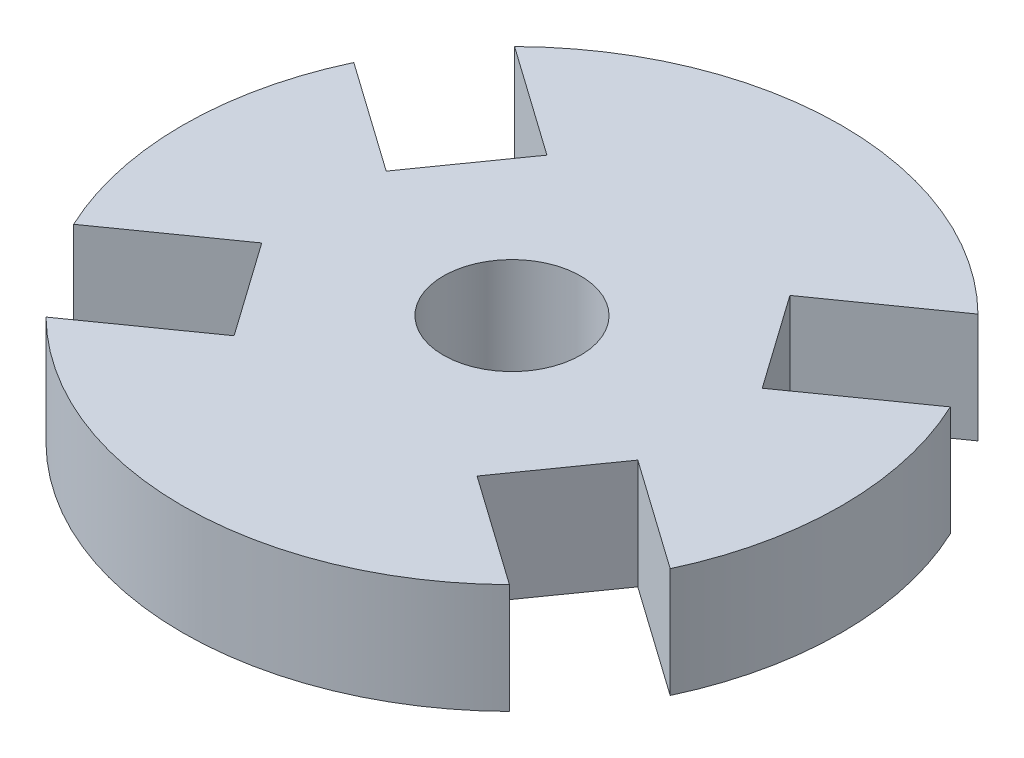
ISO-10303-21;
HEADER;
FILE_DESCRIPTION(('STEP AP214'),'2;1');
FILE_NAME('part.step','',(''),(''),'','','');
FILE_SCHEMA(('AUTOMOTIVE_DESIGN { 1 0 10303 214 1 1 1 1 }'));
ENDSEC;
DATA;
#1=APPLICATION_CONTEXT('core data for automotive mechanical design processes');
#2=APPLICATION_PROTOCOL_DEFINITION('international standard','automotive_design',2000,#1);
#3=PRODUCT_CONTEXT('',#1,'mechanical');
#4=PRODUCT('Part','Part','',(#3));
#5=PRODUCT_RELATED_PRODUCT_CATEGORY('part','',(#4));
#6=PRODUCT_DEFINITION_FORMATION('','',#4);
#7=PRODUCT_DEFINITION_CONTEXT('part definition',#1,'design');
#8=PRODUCT_DEFINITION('design','',#6,#7);
#9=PRODUCT_DEFINITION_SHAPE('','',#8);
#10=(LENGTH_UNIT() NAMED_UNIT(*) SI_UNIT(.MILLI.,.METRE.));
#11=(NAMED_UNIT(*) PLANE_ANGLE_UNIT() SI_UNIT($,.RADIAN.));
#12=(NAMED_UNIT(*) SI_UNIT($,.STERADIAN.) SOLID_ANGLE_UNIT());
#13=UNCERTAINTY_MEASURE_WITH_UNIT(LENGTH_MEASURE(1.E-05),#10,'distance_accuracy_value','');
#14=(GEOMETRIC_REPRESENTATION_CONTEXT(3) GLOBAL_UNCERTAINTY_ASSIGNED_CONTEXT((#13)) GLOBAL_UNIT_ASSIGNED_CONTEXT((#10,
#11,#12)) REPRESENTATION_CONTEXT('',''));
#15=CARTESIAN_POINT('',(0.,0.,0.));
#16=DIRECTION('',(0.,0.,1.));
#17=DIRECTION('',(1.,0.,0.));
#18=AXIS2_PLACEMENT_3D('',#15,#16,#17);
#19=CARTESIAN_POINT('',(0.,4.,0.));
#20=DIRECTION('',(0.,-1.,0.));
#21=DIRECTION('',(0.,0.,-1.));
#22=AXIS2_PLACEMENT_3D('',#19,#20,#21);
#23=CYLINDRICAL_SURFACE('',#22,12.);
#24=CARTESIAN_POINT('',(0.,0.,0.));
#25=DIRECTION('',(0.,1.,0.));
#26=DIRECTION('',(0.,0.,1.));
#27=AXIS2_PLACEMENT_3D('',#24,#25,#26);
#28=CIRCLE('',#27,12.);
#29=CARTESIAN_POINT('',(8.43841933973867,0.,-8.53188601932331));
#30=VERTEX_POINT('',#29);
#31=CARTESIAN_POINT('',(-8.43841933973867,0.,-8.53188601932331));
#32=VERTEX_POINT('',#31);
#33=EDGE_CURVE('E254',#30,#32,#28,.T.);
#34=ORIENTED_EDGE('',*,*,#33,.T.);
#35=DIRECTION('',(0.,-1.,0.));
#36=VECTOR('',#35,1.);
#37=CARTESIAN_POINT('',(-8.43841933973867,4.,-8.53188601932331));
#38=LINE('',#37,#36);
#39=CARTESIAN_POINT('',(-8.43841933973867,4.,-8.53188601932331));
#40=VERTEX_POINT('',#39);
#41=EDGE_CURVE('E159',#32,#40,#38,.F.);
#42=ORIENTED_EDGE('',*,*,#41,.T.);
#43=CARTESIAN_POINT('',(0.,4.,0.));
#44=DIRECTION('',(0.,1.,0.));
#45=DIRECTION('',(0.,0.,1.));
#46=AXIS2_PLACEMENT_3D('',#43,#44,#45);
#47=CIRCLE('',#46,12.);
#48=CARTESIAN_POINT('',(8.43841933973867,4.,-8.53188601932331));
#49=VERTEX_POINT('',#48);
#50=EDGE_CURVE('E248',#49,#40,#47,.T.);
#51=ORIENTED_EDGE('',*,*,#50,.F.);
#52=DIRECTION('',(0.,-1.,0.));
#53=VECTOR('',#52,1.);
#54=CARTESIAN_POINT('',(8.43841933973867,4.,-8.53188601932331));
#55=LINE('',#54,#53);
#56=EDGE_CURVE('E261',#49,#30,#55,.T.);
#57=ORIENTED_EDGE('',*,*,#56,.T.);
#58=EDGE_LOOP('',(#34,#42,#51,#57));
#59=FACE_BOUND('',#58,.T.);
#60=ADVANCED_FACE('F33',(#59),#23,.T.);
#61=CARTESIAN_POINT('',(-8.43841933973867,0.,8.53188601932331));
#62=VERTEX_POINT('',#61);
#63=CARTESIAN_POINT('',(8.43841933973867,0.,8.53188601932331));
#64=VERTEX_POINT('',#63);
#65=EDGE_CURVE('E258',#62,#64,#28,.T.);
#66=ORIENTED_EDGE('',*,*,#65,.T.);
#67=DIRECTION('',(0.,-1.,0.));
#68=VECTOR('',#67,1.);
#69=CARTESIAN_POINT('',(8.43841933973867,4.,8.53188601932331));
#70=LINE('',#69,#68);
#71=CARTESIAN_POINT('',(8.43841933973867,4.,8.53188601932331));
#72=VERTEX_POINT('',#71);
#73=EDGE_CURVE('E41',#64,#72,#70,.F.);
#74=ORIENTED_EDGE('',*,*,#73,.T.);
#75=CARTESIAN_POINT('',(-8.43841933973867,4.,8.53188601932331));
#76=VERTEX_POINT('',#75);
#77=EDGE_CURVE('E253',#76,#72,#47,.T.);
#78=ORIENTED_EDGE('',*,*,#77,.F.);
#79=DIRECTION('',(0.,-1.,0.));
#80=VECTOR('',#79,1.);
#81=CARTESIAN_POINT('',(-8.43841933973867,4.,8.53188601932331));
#82=LINE('',#81,#80);
#83=EDGE_CURVE('E264',#76,#62,#82,.T.);
#84=ORIENTED_EDGE('',*,*,#83,.T.);
#85=EDGE_LOOP('',(#66,#74,#78,#84));
#86=FACE_BOUND('',#85,.T.);
#87=ADVANCED_FACE('F276',(#86),#23,.T.);
#88=CARTESIAN_POINT('',(-10.8616451333047,4.,-5.10143754231678));
#89=VERTEX_POINT('',#88);
#90=CARTESIAN_POINT('',(-10.8616451333047,4.,5.10143754231678));
#91=VERTEX_POINT('',#90);
#92=EDGE_CURVE('E252',#89,#91,#47,.T.);
#93=ORIENTED_EDGE('',*,*,#92,.F.);
#94=DIRECTION('',(0.,-1.,0.));
#95=VECTOR('',#94,1.);
#96=CARTESIAN_POINT('',(-10.8616451333047,4.,-5.10143754231678));
#97=LINE('',#96,#95);
#98=CARTESIAN_POINT('',(-10.8616451333047,0.,-5.10143754231678));
#99=VERTEX_POINT('',#98);
#100=EDGE_CURVE('E152',#89,#99,#97,.T.);
#101=ORIENTED_EDGE('',*,*,#100,.T.);
#102=CARTESIAN_POINT('',(-10.8616451333047,0.,5.10143754231678));
#103=VERTEX_POINT('',#102);
#104=EDGE_CURVE('E257',#99,#103,#28,.T.);
#105=ORIENTED_EDGE('',*,*,#104,.T.);
#106=DIRECTION('',(0.,-1.,0.));
#107=VECTOR('',#106,1.);
#108=CARTESIAN_POINT('',(-10.8616451333047,4.,5.10143754231678));
#109=LINE('',#108,#107);
#110=EDGE_CURVE('E267',#103,#91,#109,.F.);
#111=ORIENTED_EDGE('',*,*,#110,.T.);
#112=EDGE_LOOP('',(#93,#101,#105,#111));
#113=FACE_BOUND('',#112,.T.);
#114=ADVANCED_FACE('F300',(#113),#23,.T.);
#115=CARTESIAN_POINT('',(0.,4.,0.));
#116=DIRECTION('',(0.,1.,0.));
#117=DIRECTION('',(0.,0.,1.));
#118=AXIS2_PLACEMENT_3D('',#115,#116,#117);
#119=PLANE('',#118);
#120=DIRECTION('',(-0.816773446906316,0.,-0.57695852227762));
#121=VECTOR('',#120,1.);
#122=CARTESIAN_POINT('',(-12.755213045315,4.,-11.5812149694506));
#123=LINE('',#122,#121);
#124=CARTESIAN_POINT('',(-4.42412388687059,4.,-5.69623804221884));
#125=VERTEX_POINT('',#124);
#126=EDGE_CURVE('E167',#125,#40,#123,.T.);
#127=ORIENTED_EDGE('',*,*,#126,.F.);
#128=DIRECTION('',(0.57695852227762,0.,-0.816773446906316));
#129=VECTOR('',#128,1.);
#130=CARTESIAN_POINT('',(-6.84734968043659,4.,-2.26578956521231));
#131=LINE('',#130,#129);
#132=CARTESIAN_POINT('',(-6.84734968043659,4.,-2.26578956521231));
#133=VERTEX_POINT('',#132);
#134=EDGE_CURVE('E149',#133,#125,#131,.T.);
#135=ORIENTED_EDGE('',*,*,#134,.F.);
#136=DIRECTION('',(0.816773446906317,0.,0.57695852227762));
#137=VECTOR('',#136,1.);
#138=CARTESIAN_POINT('',(-15.178438838881,4.,-8.15076649244404));
#139=LINE('',#138,#137);
#140=EDGE_CURVE('E171',#89,#133,#139,.T.);
#141=ORIENTED_EDGE('',*,*,#140,.F.);
#142=ORIENTED_EDGE('',*,*,#92,.T.);
#143=DIRECTION('',(-0.816773446906316,0.,0.57695852227762));
#144=VECTOR('',#143,1.);
#145=CARTESIAN_POINT('',(-15.178438838881,4.,8.15076649244404));
#146=LINE('',#145,#144);
#147=CARTESIAN_POINT('',(-6.84734968043659,4.,2.26578956521231));
#148=VERTEX_POINT('',#147);
#149=EDGE_CURVE('E202',#148,#91,#146,.T.);
#150=ORIENTED_EDGE('',*,*,#149,.F.);
#151=DIRECTION('',(-0.57695852227762,0.,-0.816773446906316));
#152=VECTOR('',#151,1.);
#153=CARTESIAN_POINT('',(-4.42412388687059,4.,5.69623804221884));
#154=LINE('',#153,#152);
#155=CARTESIAN_POINT('',(-4.42412388687059,4.,5.69623804221884));
#156=VERTEX_POINT('',#155);
#157=EDGE_CURVE('E210',#156,#148,#154,.T.);
#158=ORIENTED_EDGE('',*,*,#157,.F.);
#159=DIRECTION('',(0.816773446906316,0.,-0.57695852227762));
#160=VECTOR('',#159,1.);
#161=CARTESIAN_POINT('',(-12.755213045315,4.,11.5812149694506));
#162=LINE('',#161,#160);
#163=EDGE_CURVE('E195',#76,#156,#162,.T.);
#164=ORIENTED_EDGE('',*,*,#163,.F.);
#165=ORIENTED_EDGE('',*,*,#77,.T.);
#166=DIRECTION('',(0.816773446906316,0.,0.57695852227762));
#167=VECTOR('',#166,1.);
#168=CARTESIAN_POINT('',(12.755213045315,4.,11.5812149694506));
#169=LINE('',#168,#167);
#170=CARTESIAN_POINT('',(4.42412388687059,4.,5.69623804221884));
#171=VERTEX_POINT('',#170);
#172=EDGE_CURVE('E181',#171,#72,#169,.T.);
#173=ORIENTED_EDGE('',*,*,#172,.F.);
#174=DIRECTION('',(-0.57695852227762,0.,0.816773446906316));
#175=VECTOR('',#174,1.);
#176=CARTESIAN_POINT('',(4.42412388687059,4.,5.69623804221884));
#177=LINE('',#176,#175);
#178=CARTESIAN_POINT('',(6.84734968043659,4.,2.26578956521231));
#179=VERTEX_POINT('',#178);
#180=EDGE_CURVE('E189',#179,#171,#177,.T.);
#181=ORIENTED_EDGE('',*,*,#180,.F.);
#182=DIRECTION('',(-0.816773446906316,0.,-0.57695852227762));
#183=VECTOR('',#182,1.);
#184=CARTESIAN_POINT('',(15.178438838881,4.,8.15076649244404));
#185=LINE('',#184,#183);
#186=CARTESIAN_POINT('',(10.8616451333047,4.,5.10143754231678));
#187=VERTEX_POINT('',#186);
#188=EDGE_CURVE('E178',#187,#179,#185,.T.);
#189=ORIENTED_EDGE('',*,*,#188,.F.);
#190=CARTESIAN_POINT('',(10.8616451333047,4.,-5.10143754231678));
#191=VERTEX_POINT('',#190);
#192=EDGE_CURVE('E256',#187,#191,#47,.T.);
#193=ORIENTED_EDGE('',*,*,#192,.T.);
#194=DIRECTION('',(0.816773446906317,0.,-0.57695852227762));
#195=VECTOR('',#194,1.);
#196=CARTESIAN_POINT('',(15.178438838881,4.,-8.15076649244404));
#197=LINE('',#196,#195);
#198=CARTESIAN_POINT('',(6.84734968043659,4.,-2.26578956521231));
#199=VERTEX_POINT('',#198);
#200=EDGE_CURVE('E233',#199,#191,#197,.T.);
#201=ORIENTED_EDGE('',*,*,#200,.F.);
#202=DIRECTION('',(0.57695852227762,0.,0.816773446906316));
#203=VECTOR('',#202,1.);
#204=CARTESIAN_POINT('',(6.84734968043659,4.,-2.26578956521231));
#205=LINE('',#204,#203);
#206=CARTESIAN_POINT('',(4.42412388687059,4.,-5.69623804221884));
#207=VERTEX_POINT('',#206);
#208=EDGE_CURVE('E217',#207,#199,#205,.T.);
#209=ORIENTED_EDGE('',*,*,#208,.F.);
#210=DIRECTION('',(-0.816773446906316,0.,0.57695852227762));
#211=VECTOR('',#210,1.);
#212=CARTESIAN_POINT('',(12.755213045315,4.,-11.5812149694506));
#213=LINE('',#212,#211);
#214=EDGE_CURVE('E224',#49,#207,#213,.T.);
#215=ORIENTED_EDGE('',*,*,#214,.F.);
#216=ORIENTED_EDGE('',*,*,#50,.T.);
#217=EDGE_LOOP('',(#127,#135,#141,#142,#150,#158,#164,#165,#173,#181,#189,#193,#201,#209,#215,#216));
#218=FACE_BOUND('',#217,.T.);
#219=CARTESIAN_POINT('',(0.,4.,0.));
#220=DIRECTION('',(0.,1.,0.));
#221=DIRECTION('',(0.,0.,1.));
#222=AXIS2_PLACEMENT_3D('',#219,#220,#221);
#223=CIRCLE('',#222,2.5);
#224=CARTESIAN_POINT('',(0.,4.,2.5));
#225=VERTEX_POINT('',#224);
#226=EDGE_CURVE('E242',#225,#225,#223,.T.);
#227=ORIENTED_EDGE('',*,*,#226,.F.);
#228=EDGE_LOOP('',(#227));
#229=FACE_BOUND('',#228,.T.);
#230=ADVANCED_FACE('F283',(#218,#229),#119,.T.);
#231=CARTESIAN_POINT('',(0.,0.,0.));
#232=DIRECTION('',(0.,1.,0.));
#233=DIRECTION('',(0.,0.,1.));
#234=AXIS2_PLACEMENT_3D('',#231,#232,#233);
#235=PLANE('',#234);
#236=DIRECTION('',(0.57695852227762,0.,-0.816773446906316));
#237=VECTOR('',#236,1.);
#238=CARTESIAN_POINT('',(-6.84734968043659,0.,-2.26578956521231));
#239=LINE('',#238,#237);
#240=CARTESIAN_POINT('',(-6.84734968043659,0.,-2.26578956521232));
#241=VERTEX_POINT('',#240);
#242=CARTESIAN_POINT('',(-4.42412388687059,0.,-5.69623804221884));
#243=VERTEX_POINT('',#242);
#244=EDGE_CURVE('E48',#241,#243,#239,.T.);
#245=ORIENTED_EDGE('',*,*,#244,.T.);
#246=DIRECTION('',(-0.816773446906316,0.,-0.57695852227762));
#247=VECTOR('',#246,1.);
#248=CARTESIAN_POINT('',(-12.755213045315,0.,-11.5812149694506));
#249=LINE('',#248,#247);
#250=EDGE_CURVE('E156',#243,#32,#249,.T.);
#251=ORIENTED_EDGE('',*,*,#250,.T.);
#252=ORIENTED_EDGE('',*,*,#33,.F.);
#253=DIRECTION('',(-0.816773446906316,0.,0.57695852227762));
#254=VECTOR('',#253,1.);
#255=CARTESIAN_POINT('',(12.755213045315,0.,-11.5812149694506));
#256=LINE('',#255,#254);
#257=CARTESIAN_POINT('',(4.42412388687059,0.,-5.69623804221884));
#258=VERTEX_POINT('',#257);
#259=EDGE_CURVE('E227',#30,#258,#256,.T.);
#260=ORIENTED_EDGE('',*,*,#259,.T.);
#261=DIRECTION('',(0.57695852227762,0.,0.816773446906316));
#262=VECTOR('',#261,1.);
#263=CARTESIAN_POINT('',(6.84734968043659,0.,-2.26578956521231));
#264=LINE('',#263,#262);
#265=CARTESIAN_POINT('',(6.84734968043659,0.,-2.26578956521231));
#266=VERTEX_POINT('',#265);
#267=EDGE_CURVE('E220',#258,#266,#264,.T.);
#268=ORIENTED_EDGE('',*,*,#267,.T.);
#269=DIRECTION('',(0.816773446906317,0.,-0.57695852227762));
#270=VECTOR('',#269,1.);
#271=CARTESIAN_POINT('',(15.178438838881,0.,-8.15076649244404));
#272=LINE('',#271,#270);
#273=CARTESIAN_POINT('',(10.8616451333047,0.,-5.10143754231678));
#274=VERTEX_POINT('',#273);
#275=EDGE_CURVE('E223',#266,#274,#272,.T.);
#276=ORIENTED_EDGE('',*,*,#275,.T.);
#277=CARTESIAN_POINT('',(10.8616451333047,0.,5.10143754231678));
#278=VERTEX_POINT('',#277);
#279=EDGE_CURVE('E245',#278,#274,#28,.T.);
#280=ORIENTED_EDGE('',*,*,#279,.F.);
#281=DIRECTION('',(-0.816773446906316,0.,-0.57695852227762));
#282=VECTOR('',#281,1.);
#283=CARTESIAN_POINT('',(15.178438838881,0.,8.15076649244404));
#284=LINE('',#283,#282);
#285=CARTESIAN_POINT('',(6.84734968043659,0.,2.26578956521231));
#286=VERTEX_POINT('',#285);
#287=EDGE_CURVE('E56',#278,#286,#284,.T.);
#288=ORIENTED_EDGE('',*,*,#287,.T.);
#289=DIRECTION('',(-0.57695852227762,0.,0.816773446906316));
#290=VECTOR('',#289,1.);
#291=CARTESIAN_POINT('',(4.42412388687059,0.,5.69623804221884));
#292=LINE('',#291,#290);
#293=CARTESIAN_POINT('',(4.42412388687059,0.,5.69623804221884));
#294=VERTEX_POINT('',#293);
#295=EDGE_CURVE('E180',#286,#294,#292,.T.);
#296=ORIENTED_EDGE('',*,*,#295,.T.);
#297=DIRECTION('',(0.816773446906316,0.,0.57695852227762));
#298=VECTOR('',#297,1.);
#299=CARTESIAN_POINT('',(12.755213045315,0.,11.5812149694506));
#300=LINE('',#299,#298);
#301=EDGE_CURVE('E184',#294,#64,#300,.T.);
#302=ORIENTED_EDGE('',*,*,#301,.T.);
#303=ORIENTED_EDGE('',*,*,#65,.F.);
#304=DIRECTION('',(0.816773446906316,0.,-0.57695852227762));
#305=VECTOR('',#304,1.);
#306=CARTESIAN_POINT('',(-12.755213045315,0.,11.5812149694506));
#307=LINE('',#306,#305);
#308=CARTESIAN_POINT('',(-4.42412388687059,0.,5.69623804221884));
#309=VERTEX_POINT('',#308);
#310=EDGE_CURVE('E198',#62,#309,#307,.T.);
#311=ORIENTED_EDGE('',*,*,#310,.T.);
#312=DIRECTION('',(-0.57695852227762,0.,-0.816773446906316));
#313=VECTOR('',#312,1.);
#314=CARTESIAN_POINT('',(-4.42412388687059,0.,5.69623804221884));
#315=LINE('',#314,#313);
#316=CARTESIAN_POINT('',(-6.84734968043659,0.,2.26578956521231));
#317=VERTEX_POINT('',#316);
#318=EDGE_CURVE('E201',#309,#317,#315,.T.);
#319=ORIENTED_EDGE('',*,*,#318,.T.);
#320=DIRECTION('',(-0.816773446906316,0.,0.57695852227762));
#321=VECTOR('',#320,1.);
#322=CARTESIAN_POINT('',(-15.178438838881,0.,8.15076649244404));
#323=LINE('',#322,#321);
#324=EDGE_CURVE('E205',#317,#103,#323,.T.);
#325=ORIENTED_EDGE('',*,*,#324,.T.);
#326=ORIENTED_EDGE('',*,*,#104,.F.);
#327=DIRECTION('',(0.816773446906317,0.,0.57695852227762));
#328=VECTOR('',#327,1.);
#329=CARTESIAN_POINT('',(-1.211612896783,0.,1.71522423850326));
#330=LINE('',#329,#328);
#331=EDGE_CURVE('E11',#99,#241,#330,.T.);
#332=ORIENTED_EDGE('',*,*,#331,.T.);
#333=EDGE_LOOP('',(#245,#251,#252,#260,#268,#276,#280,#288,#296,#302,#303,#311,#319,#325,#326,#332));
#334=FACE_BOUND('',#333,.T.);
#335=CARTESIAN_POINT('',(0.,0.,0.));
#336=DIRECTION('',(0.,1.,0.));
#337=DIRECTION('',(0.,0.,1.));
#338=AXIS2_PLACEMENT_3D('',#335,#336,#337);
#339=CIRCLE('',#338,2.5);
#340=CARTESIAN_POINT('',(0.,0.,2.5));
#341=VERTEX_POINT('',#340);
#342=EDGE_CURVE('E240',#341,#341,#339,.T.);
#343=ORIENTED_EDGE('',*,*,#342,.T.);
#344=EDGE_LOOP('',(#343));
#345=FACE_BOUND('',#344,.T.);
#346=ADVANCED_FACE('F164',(#334,#345),#235,.F.);
#347=ORIENTED_EDGE('',*,*,#192,.F.);
#348=DIRECTION('',(0.,-1.,0.));
#349=VECTOR('',#348,1.);
#350=CARTESIAN_POINT('',(10.8616451333047,4.,5.10143754231678));
#351=LINE('',#350,#349);
#352=EDGE_CURVE('E270',#187,#278,#351,.T.);
#353=ORIENTED_EDGE('',*,*,#352,.T.);
#354=ORIENTED_EDGE('',*,*,#279,.T.);
#355=DIRECTION('',(0.,-1.,0.));
#356=VECTOR('',#355,1.);
#357=CARTESIAN_POINT('',(10.8616451333047,4.,-5.10143754231678));
#358=LINE('',#357,#356);
#359=EDGE_CURVE('E251',#274,#191,#358,.F.);
#360=ORIENTED_EDGE('',*,*,#359,.T.);
#361=EDGE_LOOP('',(#347,#353,#354,#360));
#362=FACE_BOUND('',#361,.T.);
#363=ADVANCED_FACE('F35',(#362),#23,.T.);
#364=CARTESIAN_POINT('',(0.,4.,0.));
#365=DIRECTION('',(0.,-1.,0.));
#366=DIRECTION('',(0.,0.,-1.));
#367=AXIS2_PLACEMENT_3D('',#364,#365,#366);
#368=CYLINDRICAL_SURFACE('',#367,2.5);
#369=ORIENTED_EDGE('',*,*,#226,.T.);
#370=EDGE_LOOP('',(#369));
#371=FACE_BOUND('',#370,.T.);
#372=ORIENTED_EDGE('',*,*,#342,.F.);
#373=EDGE_LOOP('',(#372));
#374=FACE_BOUND('',#373,.T.);
#375=ADVANCED_FACE('F327',(#371,#374),#368,.F.);
#376=CARTESIAN_POINT('',(12.755213045315,0.,-11.5812149694506));
#377=DIRECTION('',(-0.57695852227762,0.,-0.816773446906316));
#378=DIRECTION('',(-0.816773446906316,0.,0.57695852227762));
#379=AXIS2_PLACEMENT_3D('',#376,#377,#378);
#380=PLANE('',#379);
#381=ORIENTED_EDGE('',*,*,#214,.T.);
#382=DIRECTION('',(0.,1.,0.));
#383=VECTOR('',#382,1.);
#384=CARTESIAN_POINT('',(4.42412388687059,0.,-5.69623804221884));
#385=LINE('',#384,#383);
#386=EDGE_CURVE('E237',#258,#207,#385,.T.);
#387=ORIENTED_EDGE('',*,*,#386,.F.);
#388=ORIENTED_EDGE('',*,*,#259,.F.);
#389=ORIENTED_EDGE('',*,*,#56,.F.);
#390=EDGE_LOOP('',(#381,#387,#388,#389));
#391=FACE_BOUND('',#390,.T.);
#392=ADVANCED_FACE('F332',(#391),#380,.F.);
#393=CARTESIAN_POINT('',(15.178438838881,0.,-8.15076649244404));
#394=DIRECTION('',(0.57695852227762,0.,0.816773446906317));
#395=DIRECTION('',(0.816773446906317,0.,-0.57695852227762));
#396=AXIS2_PLACEMENT_3D('',#393,#394,#395);
#397=PLANE('',#396);
#398=ORIENTED_EDGE('',*,*,#275,.F.);
#399=DIRECTION('',(0.,1.,0.));
#400=VECTOR('',#399,1.);
#401=CARTESIAN_POINT('',(6.84734968043659,0.,-2.26578956521231));
#402=LINE('',#401,#400);
#403=EDGE_CURVE('E230',#266,#199,#402,.T.);
#404=ORIENTED_EDGE('',*,*,#403,.T.);
#405=ORIENTED_EDGE('',*,*,#200,.T.);
#406=ORIENTED_EDGE('',*,*,#359,.F.);
#407=EDGE_LOOP('',(#398,#404,#405,#406));
#408=FACE_BOUND('',#407,.T.);
#409=ADVANCED_FACE('F295',(#408),#397,.F.);
#410=CARTESIAN_POINT('',(6.84734968043659,0.,-2.26578956521231));
#411=DIRECTION('',(-0.816773446906316,0.,0.57695852227762));
#412=DIRECTION('',(0.57695852227762,0.,0.816773446906316));
#413=AXIS2_PLACEMENT_3D('',#410,#411,#412);
#414=PLANE('',#413);
#415=ORIENTED_EDGE('',*,*,#208,.T.);
#416=ORIENTED_EDGE('',*,*,#403,.F.);
#417=ORIENTED_EDGE('',*,*,#267,.F.);
#418=ORIENTED_EDGE('',*,*,#386,.T.);
#419=EDGE_LOOP('',(#415,#416,#417,#418));
#420=FACE_BOUND('',#419,.T.);
#421=ADVANCED_FACE('F343',(#420),#414,.F.);
#422=CARTESIAN_POINT('',(-15.178438838881,0.,8.15076649244404));
#423=DIRECTION('',(-0.57695852227762,0.,-0.816773446906316));
#424=DIRECTION('',(-0.816773446906316,0.,0.57695852227762));
#425=AXIS2_PLACEMENT_3D('',#422,#423,#424);
#426=PLANE('',#425);
#427=ORIENTED_EDGE('',*,*,#324,.F.);
#428=DIRECTION('',(0.,1.,0.));
#429=VECTOR('',#428,1.);
#430=CARTESIAN_POINT('',(-6.84734968043659,0.,2.26578956521231));
#431=LINE('',#430,#429);
#432=EDGE_CURVE('E215',#317,#148,#431,.T.);
#433=ORIENTED_EDGE('',*,*,#432,.T.);
#434=ORIENTED_EDGE('',*,*,#149,.T.);
#435=ORIENTED_EDGE('',*,*,#110,.F.);
#436=EDGE_LOOP('',(#427,#433,#434,#435));
#437=FACE_BOUND('',#436,.T.);
#438=ADVANCED_FACE('F303',(#437),#426,.F.);
#439=CARTESIAN_POINT('',(-12.755213045315,0.,11.5812149694506));
#440=DIRECTION('',(0.57695852227762,0.,0.816773446906316));
#441=DIRECTION('',(0.816773446906316,0.,-0.57695852227762));
#442=AXIS2_PLACEMENT_3D('',#439,#440,#441);
#443=PLANE('',#442);
#444=ORIENTED_EDGE('',*,*,#163,.T.);
#445=DIRECTION('',(0.,1.,0.));
#446=VECTOR('',#445,1.);
#447=CARTESIAN_POINT('',(-4.42412388687059,0.,5.69623804221884));
#448=LINE('',#447,#446);
#449=EDGE_CURVE('E208',#309,#156,#448,.T.);
#450=ORIENTED_EDGE('',*,*,#449,.F.);
#451=ORIENTED_EDGE('',*,*,#310,.F.);
#452=ORIENTED_EDGE('',*,*,#83,.F.);
#453=EDGE_LOOP('',(#444,#450,#451,#452));
#454=FACE_BOUND('',#453,.T.);
#455=ADVANCED_FACE('F352',(#454),#443,.F.);
#456=CARTESIAN_POINT('',(-4.42412388687059,0.,5.69623804221884));
#457=DIRECTION('',(0.816773446906316,0.,-0.57695852227762));
#458=DIRECTION('',(-0.57695852227762,0.,-0.816773446906316));
#459=AXIS2_PLACEMENT_3D('',#456,#457,#458);
#460=PLANE('',#459);
#461=ORIENTED_EDGE('',*,*,#157,.T.);
#462=ORIENTED_EDGE('',*,*,#432,.F.);
#463=ORIENTED_EDGE('',*,*,#318,.F.);
#464=ORIENTED_EDGE('',*,*,#449,.T.);
#465=EDGE_LOOP('',(#461,#462,#463,#464));
#466=FACE_BOUND('',#465,.T.);
#467=ADVANCED_FACE('F307',(#466),#460,.F.);
#468=CARTESIAN_POINT('',(12.755213045315,0.,11.5812149694506));
#469=DIRECTION('',(-0.57695852227762,0.,0.816773446906316));
#470=DIRECTION('',(0.816773446906316,0.,0.57695852227762));
#471=AXIS2_PLACEMENT_3D('',#468,#469,#470);
#472=PLANE('',#471);
#473=ORIENTED_EDGE('',*,*,#301,.F.);
#474=DIRECTION('',(0.,1.,0.));
#475=VECTOR('',#474,1.);
#476=CARTESIAN_POINT('',(4.42412388687059,0.,5.69623804221884));
#477=LINE('',#476,#475);
#478=EDGE_CURVE('E193',#294,#171,#477,.T.);
#479=ORIENTED_EDGE('',*,*,#478,.T.);
#480=ORIENTED_EDGE('',*,*,#172,.T.);
#481=ORIENTED_EDGE('',*,*,#73,.F.);
#482=EDGE_LOOP('',(#473,#479,#480,#481));
#483=FACE_BOUND('',#482,.T.);
#484=ADVANCED_FACE('F358',(#483),#472,.F.);
#485=CARTESIAN_POINT('',(15.178438838881,0.,8.15076649244404));
#486=DIRECTION('',(0.57695852227762,0.,-0.816773446906316));
#487=DIRECTION('',(-0.816773446906316,0.,-0.57695852227762));
#488=AXIS2_PLACEMENT_3D('',#485,#486,#487);
#489=PLANE('',#488);
#490=ORIENTED_EDGE('',*,*,#188,.T.);
#491=DIRECTION('',(0.,1.,0.));
#492=VECTOR('',#491,1.);
#493=CARTESIAN_POINT('',(6.84734968043659,0.,2.26578956521231));
#494=LINE('',#493,#492);
#495=EDGE_CURVE('E187',#286,#179,#494,.T.);
#496=ORIENTED_EDGE('',*,*,#495,.F.);
#497=ORIENTED_EDGE('',*,*,#287,.F.);
#498=ORIENTED_EDGE('',*,*,#352,.F.);
#499=EDGE_LOOP('',(#490,#496,#497,#498));
#500=FACE_BOUND('',#499,.T.);
#501=ADVANCED_FACE('F361',(#500),#489,.F.);
#502=CARTESIAN_POINT('',(4.42412388687059,0.,5.69623804221884));
#503=DIRECTION('',(-0.816773446906316,0.,-0.57695852227762));
#504=DIRECTION('',(-0.57695852227762,0.,0.816773446906316));
#505=AXIS2_PLACEMENT_3D('',#502,#503,#504);
#506=PLANE('',#505);
#507=ORIENTED_EDGE('',*,*,#180,.T.);
#508=ORIENTED_EDGE('',*,*,#478,.F.);
#509=ORIENTED_EDGE('',*,*,#295,.F.);
#510=ORIENTED_EDGE('',*,*,#495,.T.);
#511=EDGE_LOOP('',(#507,#508,#509,#510));
#512=FACE_BOUND('',#511,.T.);
#513=ADVANCED_FACE('F318',(#512),#506,.F.);
#514=CARTESIAN_POINT('',(-12.755213045315,0.,-11.5812149694506));
#515=DIRECTION('',(0.57695852227762,0.,-0.816773446906316));
#516=DIRECTION('',(-0.816773446906316,0.,-0.57695852227762));
#517=AXIS2_PLACEMENT_3D('',#514,#515,#516);
#518=PLANE('',#517);
#519=ORIENTED_EDGE('',*,*,#250,.F.);
#520=DIRECTION('',(0.,1.,0.));
#521=VECTOR('',#520,1.);
#522=CARTESIAN_POINT('',(-4.42412388687059,0.,-5.69623804221884));
#523=LINE('',#522,#521);
#524=EDGE_CURVE('E145',#243,#125,#523,.T.);
#525=ORIENTED_EDGE('',*,*,#524,.T.);
#526=ORIENTED_EDGE('',*,*,#126,.T.);
#527=ORIENTED_EDGE('',*,*,#41,.F.);
#528=EDGE_LOOP('',(#519,#525,#526,#527));
#529=FACE_BOUND('',#528,.T.);
#530=ADVANCED_FACE('F157',(#529),#518,.F.);
#531=CARTESIAN_POINT('',(-15.178438838881,0.,-8.15076649244404));
#532=DIRECTION('',(-0.57695852227762,0.,0.816773446906317));
#533=DIRECTION('',(0.816773446906317,0.,0.57695852227762));
#534=AXIS2_PLACEMENT_3D('',#531,#532,#533);
#535=PLANE('',#534);
#536=ORIENTED_EDGE('',*,*,#140,.T.);
#537=DIRECTION('',(0.,1.,0.));
#538=VECTOR('',#537,1.);
#539=CARTESIAN_POINT('',(-6.84734968043659,0.,-2.26578956521231));
#540=LINE('',#539,#538);
#541=EDGE_CURVE('E153',#241,#133,#540,.T.);
#542=ORIENTED_EDGE('',*,*,#541,.F.);
#543=ORIENTED_EDGE('',*,*,#331,.F.);
#544=ORIENTED_EDGE('',*,*,#100,.F.);
#545=EDGE_LOOP('',(#536,#542,#543,#544));
#546=FACE_BOUND('',#545,.T.);
#547=ADVANCED_FACE('F310',(#546),#535,.F.);
#548=CARTESIAN_POINT('',(-6.84734968043659,0.,-2.26578956521231));
#549=DIRECTION('',(0.816773446906316,0.,0.57695852227762));
#550=DIRECTION('',(0.57695852227762,0.,-0.816773446906316));
#551=AXIS2_PLACEMENT_3D('',#548,#549,#550);
#552=PLANE('',#551);
#553=ORIENTED_EDGE('',*,*,#134,.T.);
#554=ORIENTED_EDGE('',*,*,#524,.F.);
#555=ORIENTED_EDGE('',*,*,#244,.F.);
#556=ORIENTED_EDGE('',*,*,#541,.T.);
#557=EDGE_LOOP('',(#553,#554,#555,#556));
#558=FACE_BOUND('',#557,.T.);
#559=ADVANCED_FACE('F147',(#558),#552,.F.);
#560=CLOSED_SHELL('',(#60,#87,#114,#230,#346,#363,#375,#392,#409,#421,#438,#455,#467,#484,#501,
#513,#530,#547,#559));
#561=MANIFOLD_SOLID_BREP('B2',#560);
#562=ADVANCED_BREP_SHAPE_REPRESENTATION('',(#18,#561),#14);
#563=SHAPE_DEFINITION_REPRESENTATION(#9,#562);
ENDSEC;
END-ISO-10303-21;
